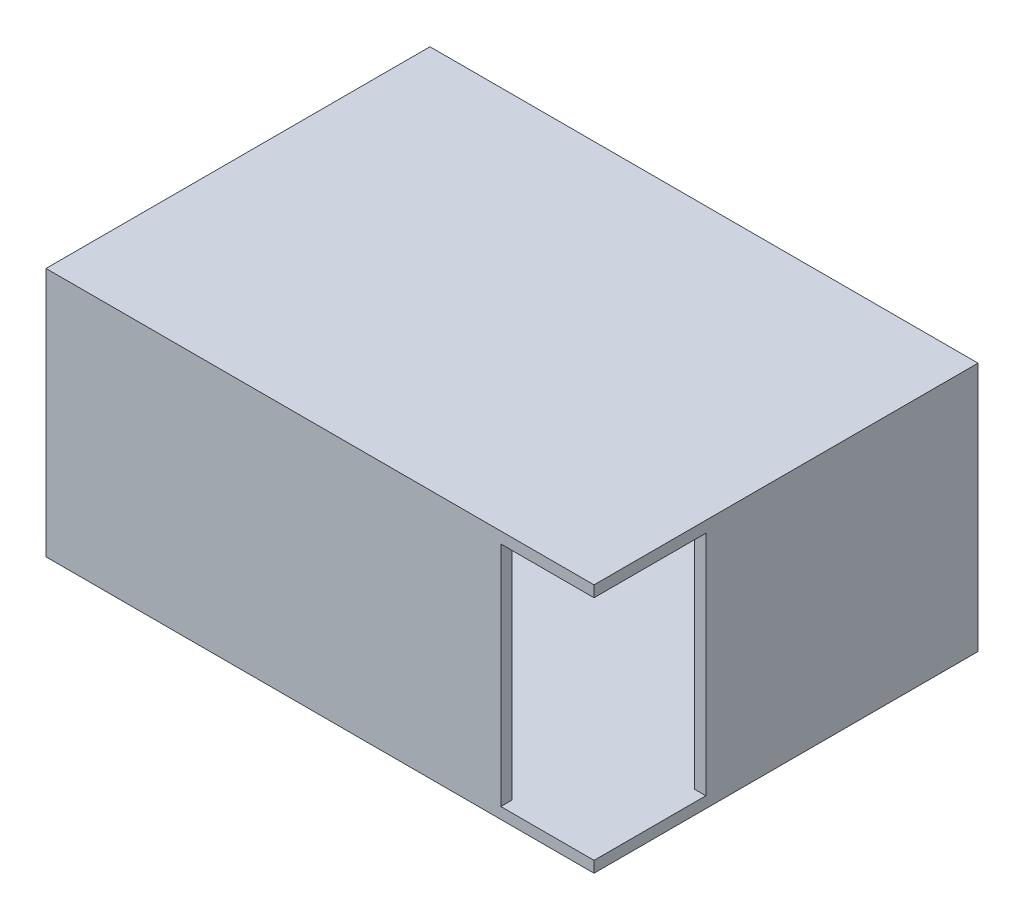
ISO-10303-21;
HEADER;
FILE_DESCRIPTION(('STEP AP214'),'2;1');
FILE_NAME('part.step','',(''),(''),'','','');
FILE_SCHEMA(('AUTOMOTIVE_DESIGN { 1 0 10303 214 1 1 1 1 }'));
ENDSEC;
DATA;
#1=APPLICATION_CONTEXT('core data for automotive mechanical design processes');
#2=APPLICATION_PROTOCOL_DEFINITION('international standard','automotive_design',2000,#1);
#3=PRODUCT_CONTEXT('',#1,'mechanical');
#4=PRODUCT('Part','Part','',(#3));
#5=PRODUCT_RELATED_PRODUCT_CATEGORY('part','',(#4));
#6=PRODUCT_DEFINITION_FORMATION('','',#4);
#7=PRODUCT_DEFINITION_CONTEXT('part definition',#1,'design');
#8=PRODUCT_DEFINITION('design','',#6,#7);
#9=PRODUCT_DEFINITION_SHAPE('','',#8);
#10=(LENGTH_UNIT() NAMED_UNIT(*) SI_UNIT(.MILLI.,.METRE.));
#11=(NAMED_UNIT(*) PLANE_ANGLE_UNIT() SI_UNIT($,.RADIAN.));
#12=(NAMED_UNIT(*) SI_UNIT($,.STERADIAN.) SOLID_ANGLE_UNIT());
#13=UNCERTAINTY_MEASURE_WITH_UNIT(LENGTH_MEASURE(1.E-05),#10,'distance_accuracy_value','');
#14=(GEOMETRIC_REPRESENTATION_CONTEXT(3) GLOBAL_UNCERTAINTY_ASSIGNED_CONTEXT((#13)) GLOBAL_UNIT_ASSIGNED_CONTEXT((#10,
#11,#12)) REPRESENTATION_CONTEXT('',''));
#15=CARTESIAN_POINT('',(0.,0.,0.));
#16=DIRECTION('',(0.,0.,1.));
#17=DIRECTION('',(1.,0.,0.));
#18=AXIS2_PLACEMENT_3D('',#15,#16,#17);
#19=CARTESIAN_POINT('',(186.69,0.,0.));
#20=DIRECTION('',(0.,1.,0.));
#21=DIRECTION('',(0.,0.,1.));
#22=AXIS2_PLACEMENT_3D('',#19,#20,#21);
#23=PLANE('',#22);
#24=DIRECTION('',(0.,0.,-1.));
#25=VECTOR('',#24,1.);
#26=CARTESIAN_POINT('',(0.,0.,0.));
#27=LINE('',#26,#25);
#28=CARTESIAN_POINT('',(0.,0.,130.81));
#29=VERTEX_POINT('',#28);
#30=CARTESIAN_POINT('',(0.,0.,0.));
#31=VERTEX_POINT('',#30);
#32=EDGE_CURVE('E204',#29,#31,#27,.T.);
#33=ORIENTED_EDGE('',*,*,#32,.T.);
#34=DIRECTION('',(-1.,0.,0.));
#35=VECTOR('',#34,1.);
#36=CARTESIAN_POINT('',(186.69,0.,0.));
#37=LINE('',#36,#35);
#38=CARTESIAN_POINT('',(186.69,0.,0.));
#39=VERTEX_POINT('',#38);
#40=EDGE_CURVE('E253',#39,#31,#37,.T.);
#41=ORIENTED_EDGE('',*,*,#40,.F.);
#42=DIRECTION('',(0.,0.,-1.));
#43=VECTOR('',#42,1.);
#44=CARTESIAN_POINT('',(186.69,0.,0.));
#45=LINE('',#44,#43);
#46=CARTESIAN_POINT('',(186.69,0.,130.81));
#47=VERTEX_POINT('',#46);
#48=EDGE_CURVE('E214',#47,#39,#45,.T.);
#49=ORIENTED_EDGE('',*,*,#48,.F.);
#50=DIRECTION('',(-1.,0.,0.));
#51=VECTOR('',#50,1.);
#52=CARTESIAN_POINT('',(186.69,0.,130.81));
#53=LINE('',#52,#51);
#54=EDGE_CURVE('E230',#47,#29,#53,.T.);
#55=ORIENTED_EDGE('',*,*,#54,.T.);
#56=EDGE_LOOP('',(#33,#41,#49,#55));
#57=FACE_BOUND('',#56,.T.);
#58=ADVANCED_FACE('F45',(#57),#23,.F.);
#59=CARTESIAN_POINT('',(186.69,0.,0.));
#60=DIRECTION('',(0.,0.,1.));
#61=DIRECTION('',(1.,0.,0.));
#62=AXIS2_PLACEMENT_3D('',#59,#60,#61);
#63=PLANE('',#62);
#64=DIRECTION('',(1.,0.,0.));
#65=VECTOR('',#64,1.);
#66=CARTESIAN_POINT('',(3.81,81.28,0.));
#67=LINE('',#66,#65);
#68=CARTESIAN_POINT('',(3.81000000000001,81.28,0.));
#69=VERTEX_POINT('',#68);
#70=CARTESIAN_POINT('',(182.88,81.28,0.));
#71=VERTEX_POINT('',#70);
#72=EDGE_CURVE('E165',#69,#71,#67,.T.);
#73=ORIENTED_EDGE('',*,*,#72,.F.);
#74=DIRECTION('',(0.,1.,0.));
#75=VECTOR('',#74,1.);
#76=CARTESIAN_POINT('',(3.81,81.28,0.));
#77=LINE('',#76,#75);
#78=CARTESIAN_POINT('',(3.81,3.81,0.));
#79=VERTEX_POINT('',#78);
#80=EDGE_CURVE('E60',#79,#69,#77,.T.);
#81=ORIENTED_EDGE('',*,*,#80,.F.);
#82=DIRECTION('',(-1.,0.,0.));
#83=VECTOR('',#82,1.);
#84=CARTESIAN_POINT('',(3.81,3.81,0.));
#85=LINE('',#84,#83);
#86=CARTESIAN_POINT('',(182.88,3.81,0.));
#87=VERTEX_POINT('',#86);
#88=EDGE_CURVE('E154',#87,#79,#85,.T.);
#89=ORIENTED_EDGE('',*,*,#88,.F.);
#90=DIRECTION('',(0.,-1.,0.));
#91=VECTOR('',#90,1.);
#92=CARTESIAN_POINT('',(182.88,81.28,0.));
#93=LINE('',#92,#91);
#94=EDGE_CURVE('E158',#71,#87,#93,.T.);
#95=ORIENTED_EDGE('',*,*,#94,.F.);
#96=EDGE_LOOP('',(#73,#81,#89,#95));
#97=FACE_BOUND('',#96,.T.);
#98=DIRECTION('',(0.,1.,0.));
#99=VECTOR('',#98,1.);
#100=CARTESIAN_POINT('',(0.,0.,0.));
#101=LINE('',#100,#99);
#102=CARTESIAN_POINT('',(0.,85.09,0.));
#103=VERTEX_POINT('',#102);
#104=EDGE_CURVE('E234',#31,#103,#101,.T.);
#105=ORIENTED_EDGE('',*,*,#104,.T.);
#106=DIRECTION('',(-1.,0.,0.));
#107=VECTOR('',#106,1.);
#108=CARTESIAN_POINT('',(186.69,85.09,0.));
#109=LINE('',#108,#107);
#110=CARTESIAN_POINT('',(186.69,85.09,0.));
#111=VERTEX_POINT('',#110);
#112=EDGE_CURVE('E249',#111,#103,#109,.T.);
#113=ORIENTED_EDGE('',*,*,#112,.F.);
#114=DIRECTION('',(0.,1.,0.));
#115=VECTOR('',#114,1.);
#116=CARTESIAN_POINT('',(186.69,0.,0.));
#117=LINE('',#116,#115);
#118=EDGE_CURVE('E218',#39,#111,#117,.T.);
#119=ORIENTED_EDGE('',*,*,#118,.F.);
#120=ORIENTED_EDGE('',*,*,#40,.T.);
#121=EDGE_LOOP('',(#105,#113,#119,#120));
#122=FACE_BOUND('',#121,.T.);
#123=ADVANCED_FACE('F281',(#97,#122),#63,.F.);
#124=CARTESIAN_POINT('',(186.69,85.09,0.));
#125=DIRECTION('',(0.,-1.,0.));
#126=DIRECTION('',(0.,0.,-1.));
#127=AXIS2_PLACEMENT_3D('',#124,#125,#126);
#128=PLANE('',#127);
#129=DIRECTION('',(0.,0.,1.));
#130=VECTOR('',#129,1.);
#131=CARTESIAN_POINT('',(0.,85.09,0.));
#132=LINE('',#131,#130);
#133=CARTESIAN_POINT('',(0.,85.09,130.81));
#134=VERTEX_POINT('',#133);
#135=EDGE_CURVE('E237',#103,#134,#132,.T.);
#136=ORIENTED_EDGE('',*,*,#135,.T.);
#137=DIRECTION('',(-1.,0.,0.));
#138=VECTOR('',#137,1.);
#139=CARTESIAN_POINT('',(186.69,85.09,130.81));
#140=LINE('',#139,#138);
#141=CARTESIAN_POINT('',(186.69,85.09,130.81));
#142=VERTEX_POINT('',#141);
#143=EDGE_CURVE('E245',#142,#134,#140,.T.);
#144=ORIENTED_EDGE('',*,*,#143,.F.);
#145=DIRECTION('',(0.,0.,1.));
#146=VECTOR('',#145,1.);
#147=CARTESIAN_POINT('',(186.69,85.09,0.));
#148=LINE('',#147,#146);
#149=EDGE_CURVE('E222',#111,#142,#148,.T.);
#150=ORIENTED_EDGE('',*,*,#149,.F.);
#151=ORIENTED_EDGE('',*,*,#112,.T.);
#152=EDGE_LOOP('',(#136,#144,#150,#151));
#153=FACE_BOUND('',#152,.T.);
#154=ADVANCED_FACE('F288',(#153),#128,.F.);
#155=CARTESIAN_POINT('',(186.69,0.,130.81));
#156=DIRECTION('',(0.,0.,-1.));
#157=DIRECTION('',(-1.,0.,0.));
#158=AXIS2_PLACEMENT_3D('',#155,#156,#157);
#159=PLANE('',#158);
#160=DIRECTION('',(0.,-1.,0.));
#161=VECTOR('',#160,1.);
#162=CARTESIAN_POINT('',(186.69,0.,130.81));
#163=LINE('',#162,#161);
#164=CARTESIAN_POINT('',(186.69,3.80999999999999,130.81));
#165=VERTEX_POINT('',#164);
#166=EDGE_CURVE('E225',#165,#47,#163,.T.);
#167=ORIENTED_EDGE('',*,*,#166,.F.);
#168=DIRECTION('',(1.,0.,0.));
#169=VECTOR('',#168,1.);
#170=CARTESIAN_POINT('',(154.94,3.80999999999999,130.81));
#171=LINE('',#170,#169);
#172=CARTESIAN_POINT('',(154.94,3.80999999999999,130.81));
#173=VERTEX_POINT('',#172);
#174=EDGE_CURVE('E201',#173,#165,#171,.T.);
#175=ORIENTED_EDGE('',*,*,#174,.F.);
#176=DIRECTION('',(0.,-1.,0.));
#177=VECTOR('',#176,1.);
#178=CARTESIAN_POINT('',(154.94,3.80999999999999,130.81));
#179=LINE('',#178,#177);
#180=CARTESIAN_POINT('',(154.94,81.28,130.81));
#181=VERTEX_POINT('',#180);
#182=EDGE_CURVE('E187',#181,#173,#179,.T.);
#183=ORIENTED_EDGE('',*,*,#182,.F.);
#184=DIRECTION('',(1.,0.,0.));
#185=VECTOR('',#184,1.);
#186=CARTESIAN_POINT('',(154.94,81.28,130.81));
#187=LINE('',#186,#185);
#188=CARTESIAN_POINT('',(186.69,81.28,130.81));
#189=VERTEX_POINT('',#188);
#190=EDGE_CURVE('E205',#181,#189,#187,.T.);
#191=ORIENTED_EDGE('',*,*,#190,.T.);
#192=EDGE_CURVE('E226',#142,#189,#163,.T.);
#193=ORIENTED_EDGE('',*,*,#192,.F.);
#194=ORIENTED_EDGE('',*,*,#143,.T.);
#195=DIRECTION('',(0.,-1.,0.));
#196=VECTOR('',#195,1.);
#197=CARTESIAN_POINT('',(0.,0.,130.81));
#198=LINE('',#197,#196);
#199=EDGE_CURVE('E219',#134,#29,#198,.T.);
#200=ORIENTED_EDGE('',*,*,#199,.T.);
#201=ORIENTED_EDGE('',*,*,#54,.F.);
#202=EDGE_LOOP('',(#167,#175,#183,#191,#193,#194,#200,#201));
#203=FACE_BOUND('',#202,.T.);
#204=ADVANCED_FACE('F266',(#203),#159,.F.);
#205=CARTESIAN_POINT('',(186.69,0.,0.));
#206=DIRECTION('',(-1.,0.,0.));
#207=DIRECTION('',(0.,0.,1.));
#208=AXIS2_PLACEMENT_3D('',#205,#206,#207);
#209=PLANE('',#208);
#210=DIRECTION('',(0.,1.,0.));
#211=VECTOR('',#210,1.);
#212=CARTESIAN_POINT('',(186.69,3.81000000000001,92.71));
#213=LINE('',#212,#211);
#214=CARTESIAN_POINT('',(186.69,3.81000000000001,92.71));
#215=VERTEX_POINT('',#214);
#216=CARTESIAN_POINT('',(186.69,81.28,92.71));
#217=VERTEX_POINT('',#216);
#218=EDGE_CURVE('E195',#215,#217,#213,.T.);
#219=ORIENTED_EDGE('',*,*,#218,.F.);
#220=DIRECTION('',(0.,0.,-1.));
#221=VECTOR('',#220,1.);
#222=CARTESIAN_POINT('',(186.69,3.80999999999999,130.81));
#223=LINE('',#222,#221);
#224=EDGE_CURVE('E174',#165,#215,#223,.T.);
#225=ORIENTED_EDGE('',*,*,#224,.F.);
#226=ORIENTED_EDGE('',*,*,#166,.T.);
#227=ORIENTED_EDGE('',*,*,#48,.T.);
#228=ORIENTED_EDGE('',*,*,#118,.T.);
#229=ORIENTED_EDGE('',*,*,#149,.T.);
#230=ORIENTED_EDGE('',*,*,#192,.T.);
#231=DIRECTION('',(0.,0.,1.));
#232=VECTOR('',#231,1.);
#233=CARTESIAN_POINT('',(186.69,81.28,130.81));
#234=LINE('',#233,#232);
#235=EDGE_CURVE('E184',#217,#189,#234,.T.);
#236=ORIENTED_EDGE('',*,*,#235,.F.);
#237=EDGE_LOOP('',(#219,#225,#226,#227,#228,#229,#230,#236));
#238=FACE_BOUND('',#237,.T.);
#239=ADVANCED_FACE('F271',(#238),#209,.F.);
#240=CARTESIAN_POINT('',(0.,0.,0.));
#241=DIRECTION('',(-1.,0.,0.));
#242=DIRECTION('',(0.,0.,1.));
#243=AXIS2_PLACEMENT_3D('',#240,#241,#242);
#244=PLANE('',#243);
#245=ORIENTED_EDGE('',*,*,#32,.F.);
#246=ORIENTED_EDGE('',*,*,#199,.F.);
#247=ORIENTED_EDGE('',*,*,#135,.F.);
#248=ORIENTED_EDGE('',*,*,#104,.F.);
#249=EDGE_LOOP('',(#245,#246,#247,#248));
#250=FACE_BOUND('',#249,.T.);
#251=ADVANCED_FACE('F293',(#250),#244,.T.);
#252=CARTESIAN_POINT('',(154.94,3.80999999999999,130.81));
#253=DIRECTION('',(0.,-1.,0.));
#254=DIRECTION('',(0.,0.,-1.));
#255=AXIS2_PLACEMENT_3D('',#252,#253,#254);
#256=PLANE('',#255);
#257=DIRECTION('',(1.,0.,0.));
#258=VECTOR('',#257,1.);
#259=CARTESIAN_POINT('',(154.94,3.81000000000001,92.71));
#260=LINE('',#259,#258);
#261=CARTESIAN_POINT('',(182.88,3.81,92.71));
#262=VERTEX_POINT('',#261);
#263=EDGE_CURVE('E191',#262,#215,#260,.T.);
#264=ORIENTED_EDGE('',*,*,#263,.F.);
#265=DIRECTION('',(0.,0.,-1.));
#266=VECTOR('',#265,1.);
#267=CARTESIAN_POINT('',(182.88,3.81,127.));
#268=LINE('',#267,#266);
#269=EDGE_CURVE('E175',#262,#87,#268,.T.);
#270=ORIENTED_EDGE('',*,*,#269,.T.);
#271=ORIENTED_EDGE('',*,*,#88,.T.);
#272=DIRECTION('',(0.,0.,-1.));
#273=VECTOR('',#272,1.);
#274=CARTESIAN_POINT('',(3.81,3.81,127.));
#275=LINE('',#274,#273);
#276=CARTESIAN_POINT('',(3.81,3.81,127.));
#277=VERTEX_POINT('',#276);
#278=EDGE_CURVE('E171',#277,#79,#275,.T.);
#279=ORIENTED_EDGE('',*,*,#278,.F.);
#280=DIRECTION('',(-1.,0.,0.));
#281=VECTOR('',#280,1.);
#282=CARTESIAN_POINT('',(3.81,3.81,127.));
#283=LINE('',#282,#281);
#284=CARTESIAN_POINT('',(154.94,3.81,127.));
#285=VERTEX_POINT('',#284);
#286=EDGE_CURVE('E141',#285,#277,#283,.T.);
#287=ORIENTED_EDGE('',*,*,#286,.F.);
#288=DIRECTION('',(0.,0.,-1.));
#289=VECTOR('',#288,1.);
#290=CARTESIAN_POINT('',(154.94,3.80999999999999,130.81));
#291=LINE('',#290,#289);
#292=EDGE_CURVE('E180',#173,#285,#291,.T.);
#293=ORIENTED_EDGE('',*,*,#292,.F.);
#294=ORIENTED_EDGE('',*,*,#174,.T.);
#295=ORIENTED_EDGE('',*,*,#224,.T.);
#296=EDGE_LOOP('',(#264,#270,#271,#279,#287,#293,#294,#295));
#297=FACE_BOUND('',#296,.T.);
#298=ADVANCED_FACE('F260',(#297),#256,.F.);
#299=CARTESIAN_POINT('',(154.94,81.28,130.81));
#300=DIRECTION('',(0.,1.,0.));
#301=DIRECTION('',(0.,0.,1.));
#302=AXIS2_PLACEMENT_3D('',#299,#300,#301);
#303=PLANE('',#302);
#304=DIRECTION('',(0.,0.,-1.));
#305=VECTOR('',#304,1.);
#306=CARTESIAN_POINT('',(182.88,81.28,127.));
#307=LINE('',#306,#305);
#308=CARTESIAN_POINT('',(182.88,81.28,92.71));
#309=VERTEX_POINT('',#308);
#310=EDGE_CURVE('E140',#309,#71,#307,.T.);
#311=ORIENTED_EDGE('',*,*,#310,.F.);
#312=DIRECTION('',(1.,0.,0.));
#313=VECTOR('',#312,1.);
#314=CARTESIAN_POINT('',(154.94,81.28,92.71));
#315=LINE('',#314,#313);
#316=EDGE_CURVE('E209',#309,#217,#315,.T.);
#317=ORIENTED_EDGE('',*,*,#316,.T.);
#318=ORIENTED_EDGE('',*,*,#235,.T.);
#319=ORIENTED_EDGE('',*,*,#190,.F.);
#320=DIRECTION('',(0.,0.,1.));
#321=VECTOR('',#320,1.);
#322=CARTESIAN_POINT('',(154.94,81.28,130.81));
#323=LINE('',#322,#321);
#324=CARTESIAN_POINT('',(154.94,81.28,127.));
#325=VERTEX_POINT('',#324);
#326=EDGE_CURVE('E147',#325,#181,#323,.T.);
#327=ORIENTED_EDGE('',*,*,#326,.F.);
#328=DIRECTION('',(1.,0.,0.));
#329=VECTOR('',#328,1.);
#330=CARTESIAN_POINT('',(3.81,81.28,127.));
#331=LINE('',#330,#329);
#332=CARTESIAN_POINT('',(3.81,81.28,127.));
#333=VERTEX_POINT('',#332);
#334=EDGE_CURVE('E68',#333,#325,#331,.T.);
#335=ORIENTED_EDGE('',*,*,#334,.F.);
#336=DIRECTION('',(0.,0.,-1.));
#337=VECTOR('',#336,1.);
#338=CARTESIAN_POINT('',(3.81,81.28,127.));
#339=LINE('',#338,#337);
#340=EDGE_CURVE('E133',#333,#69,#339,.T.);
#341=ORIENTED_EDGE('',*,*,#340,.T.);
#342=ORIENTED_EDGE('',*,*,#72,.T.);
#343=EDGE_LOOP('',(#311,#317,#318,#319,#327,#335,#341,#342));
#344=FACE_BOUND('',#343,.T.);
#345=ADVANCED_FACE('F145',(#344),#303,.F.);
#346=CARTESIAN_POINT('',(154.94,3.81000000000001,92.71));
#347=DIRECTION('',(0.,0.,-1.));
#348=DIRECTION('',(-1.,0.,0.));
#349=AXIS2_PLACEMENT_3D('',#346,#347,#348);
#350=PLANE('',#349);
#351=ORIENTED_EDGE('',*,*,#316,.F.);
#352=DIRECTION('',(0.,-1.,0.));
#353=VECTOR('',#352,1.);
#354=CARTESIAN_POINT('',(182.88,3.81000000000001,92.71));
#355=LINE('',#354,#353);
#356=EDGE_CURVE('E11',#309,#262,#355,.T.);
#357=ORIENTED_EDGE('',*,*,#356,.T.);
#358=ORIENTED_EDGE('',*,*,#263,.T.);
#359=ORIENTED_EDGE('',*,*,#218,.T.);
#360=EDGE_LOOP('',(#351,#357,#358,#359));
#361=FACE_BOUND('',#360,.T.);
#362=ADVANCED_FACE('F275',(#361),#350,.F.);
#363=CARTESIAN_POINT('',(154.94,0.,0.));
#364=DIRECTION('',(1.,0.,0.));
#365=DIRECTION('',(0.,0.,-1.));
#366=AXIS2_PLACEMENT_3D('',#363,#364,#365);
#367=PLANE('',#366);
#368=DIRECTION('',(0.,-1.,0.));
#369=VECTOR('',#368,1.);
#370=CARTESIAN_POINT('',(154.94,0.,127.));
#371=LINE('',#370,#369);
#372=EDGE_CURVE('E53',#325,#285,#371,.T.);
#373=ORIENTED_EDGE('',*,*,#372,.F.);
#374=ORIENTED_EDGE('',*,*,#326,.T.);
#375=ORIENTED_EDGE('',*,*,#182,.T.);
#376=ORIENTED_EDGE('',*,*,#292,.T.);
#377=EDGE_LOOP('',(#373,#374,#375,#376));
#378=FACE_BOUND('',#377,.T.);
#379=ADVANCED_FACE('F261',(#378),#367,.T.);
#380=CARTESIAN_POINT('',(182.88,81.28,127.));
#381=DIRECTION('',(1.,0.,0.));
#382=DIRECTION('',(0.,0.,-1.));
#383=AXIS2_PLACEMENT_3D('',#380,#381,#382);
#384=PLANE('',#383);
#385=ORIENTED_EDGE('',*,*,#310,.T.);
#386=ORIENTED_EDGE('',*,*,#94,.T.);
#387=ORIENTED_EDGE('',*,*,#269,.F.);
#388=ORIENTED_EDGE('',*,*,#356,.F.);
#389=EDGE_LOOP('',(#385,#386,#387,#388));
#390=FACE_BOUND('',#389,.T.);
#391=ADVANCED_FACE('F279',(#390),#384,.F.);
#392=CARTESIAN_POINT('',(3.81,81.28,127.));
#393=DIRECTION('',(-1.,0.,0.));
#394=DIRECTION('',(0.,0.,1.));
#395=AXIS2_PLACEMENT_3D('',#392,#393,#394);
#396=PLANE('',#395);
#397=ORIENTED_EDGE('',*,*,#80,.T.);
#398=ORIENTED_EDGE('',*,*,#340,.F.);
#399=DIRECTION('',(0.,1.,0.));
#400=VECTOR('',#399,1.);
#401=CARTESIAN_POINT('',(3.81,81.28,127.));
#402=LINE('',#401,#400);
#403=EDGE_CURVE('E135',#277,#333,#402,.T.);
#404=ORIENTED_EDGE('',*,*,#403,.F.);
#405=ORIENTED_EDGE('',*,*,#278,.T.);
#406=EDGE_LOOP('',(#397,#398,#404,#405));
#407=FACE_BOUND('',#406,.T.);
#408=ADVANCED_FACE('F134',(#407),#396,.F.);
#409=CARTESIAN_POINT('',(0.,0.,127.));
#410=DIRECTION('',(0.,0.,1.));
#411=DIRECTION('',(1.,0.,0.));
#412=AXIS2_PLACEMENT_3D('',#409,#410,#411);
#413=PLANE('',#412);
#414=ORIENTED_EDGE('',*,*,#372,.T.);
#415=ORIENTED_EDGE('',*,*,#286,.T.);
#416=ORIENTED_EDGE('',*,*,#403,.T.);
#417=ORIENTED_EDGE('',*,*,#334,.T.);
#418=EDGE_LOOP('',(#414,#415,#416,#417));
#419=FACE_BOUND('',#418,.T.);
#420=ADVANCED_FACE('F150',(#419),#413,.F.);
#421=CLOSED_SHELL('',(#58,#123,#154,#204,#239,#251,#298,#345,#362,#379,#391,#408,#420));
#422=MANIFOLD_SOLID_BREP('B2',#421);
#423=ADVANCED_BREP_SHAPE_REPRESENTATION('',(#18,#422),#14);
#424=SHAPE_DEFINITION_REPRESENTATION(#9,#423);
ENDSEC;
END-ISO-10303-21;
